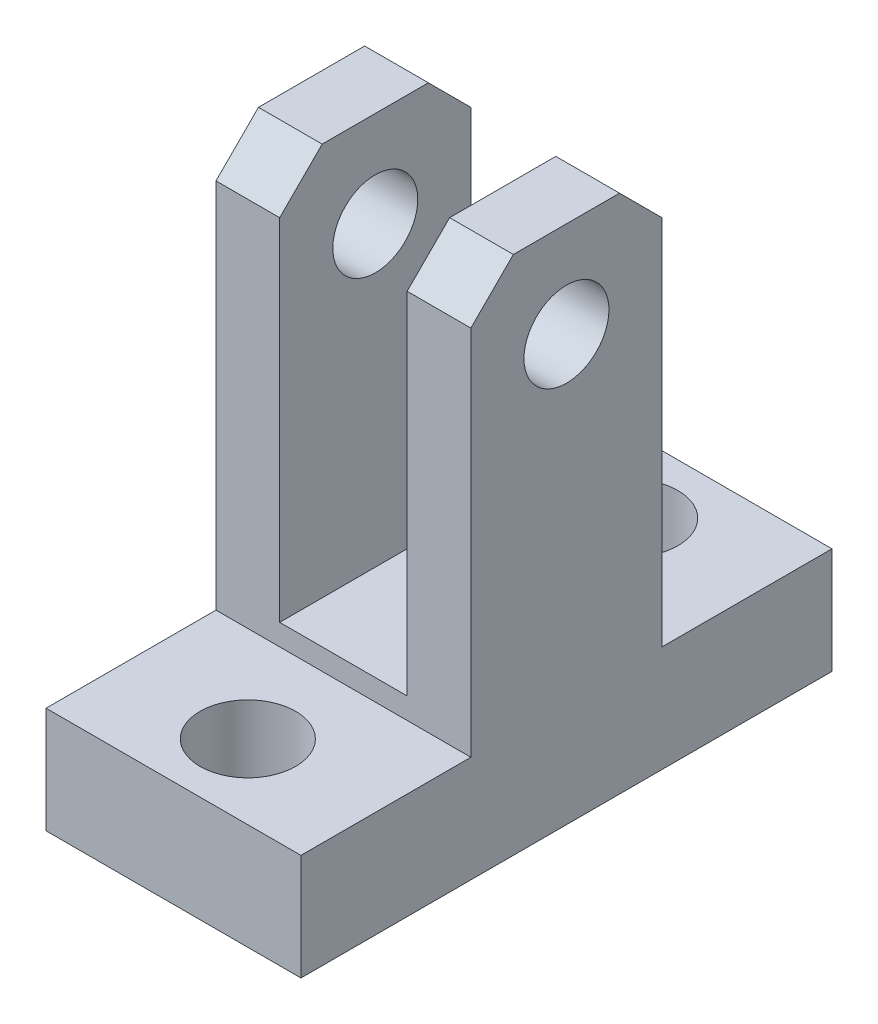
ISO-10303-21;
HEADER;
FILE_DESCRIPTION(('STEP AP214'),'2;1');
FILE_NAME('part.step','',(''),(''),'','','');
FILE_SCHEMA(('AUTOMOTIVE_DESIGN { 1 0 10303 214 1 1 1 1 }'));
ENDSEC;
DATA;
#1=APPLICATION_CONTEXT('core data for automotive mechanical design processes');
#2=APPLICATION_PROTOCOL_DEFINITION('international standard','automotive_design',2000,#1);
#3=PRODUCT_CONTEXT('',#1,'mechanical');
#4=PRODUCT('Part','Part','',(#3));
#5=PRODUCT_RELATED_PRODUCT_CATEGORY('part','',(#4));
#6=PRODUCT_DEFINITION_FORMATION('','',#4);
#7=PRODUCT_DEFINITION_CONTEXT('part definition',#1,'design');
#8=PRODUCT_DEFINITION('design','',#6,#7);
#9=PRODUCT_DEFINITION_SHAPE('','',#8);
#10=(LENGTH_UNIT() NAMED_UNIT(*) SI_UNIT(.MILLI.,.METRE.));
#11=(NAMED_UNIT(*) PLANE_ANGLE_UNIT() SI_UNIT($,.RADIAN.));
#12=(NAMED_UNIT(*) SI_UNIT($,.STERADIAN.) SOLID_ANGLE_UNIT());
#13=UNCERTAINTY_MEASURE_WITH_UNIT(LENGTH_MEASURE(1.E-05),#10,'distance_accuracy_value','');
#14=(GEOMETRIC_REPRESENTATION_CONTEXT(3) GLOBAL_UNCERTAINTY_ASSIGNED_CONTEXT((#13)) GLOBAL_UNIT_ASSIGNED_CONTEXT((#10,
#11,#12)) REPRESENTATION_CONTEXT('',''));
#15=CARTESIAN_POINT('',(0.,0.,0.));
#16=DIRECTION('',(0.,0.,1.));
#17=DIRECTION('',(1.,0.,0.));
#18=AXIS2_PLACEMENT_3D('',#15,#16,#17);
#19=CARTESIAN_POINT('',(6.,24.5,-4.5));
#20=DIRECTION('',(0.,-1.,0.));
#21=DIRECTION('',(0.,0.,-1.));
#22=AXIS2_PLACEMENT_3D('',#19,#20,#21);
#23=PLANE('',#22);
#24=DIRECTION('',(1.,0.,0.));
#25=VECTOR('',#24,1.);
#26=CARTESIAN_POINT('',(6.,24.5,2.49999999999999));
#27=LINE('',#26,#25);
#28=CARTESIAN_POINT('',(-6.,24.5,2.49999999999999));
#29=VERTEX_POINT('',#28);
#30=CARTESIAN_POINT('',(-3.,24.5,2.5));
#31=VERTEX_POINT('',#30);
#32=EDGE_CURVE('E177',#29,#31,#27,.T.);
#33=ORIENTED_EDGE('',*,*,#32,.T.);
#34=DIRECTION('',(0.,0.,1.));
#35=VECTOR('',#34,1.);
#36=CARTESIAN_POINT('',(-3.,24.5,-12.5));
#37=LINE('',#36,#35);
#38=CARTESIAN_POINT('',(-3.,24.5,-2.49999999999999));
#39=VERTEX_POINT('',#38);
#40=EDGE_CURVE('E171',#39,#31,#37,.T.);
#41=ORIENTED_EDGE('',*,*,#40,.F.);
#42=DIRECTION('',(-1.,0.,0.));
#43=VECTOR('',#42,1.);
#44=CARTESIAN_POINT('',(6.,24.5,-2.49999999999999));
#45=LINE('',#44,#43);
#46=CARTESIAN_POINT('',(-6.,24.5,-2.49999999999999));
#47=VERTEX_POINT('',#46);
#48=EDGE_CURVE('E181',#39,#47,#45,.T.);
#49=ORIENTED_EDGE('',*,*,#48,.T.);
#50=DIRECTION('',(0.,0.,1.));
#51=VECTOR('',#50,1.);
#52=CARTESIAN_POINT('',(-6.,24.5,-4.5));
#53=LINE('',#52,#51);
#54=EDGE_CURVE('E243',#47,#29,#53,.T.);
#55=ORIENTED_EDGE('',*,*,#54,.T.);
#56=EDGE_LOOP('',(#33,#41,#49,#55));
#57=FACE_BOUND('',#56,.T.);
#58=ADVANCED_FACE('F39',(#57),#23,.F.);
#59=CARTESIAN_POINT('',(-6.,20.,0.));
#60=DIRECTION('',(1.,0.,0.));
#61=DIRECTION('',(0.,0.,-1.));
#62=AXIS2_PLACEMENT_3D('',#59,#60,#61);
#63=CYLINDRICAL_SURFACE('',#62,2.);
#64=CARTESIAN_POINT('',(-3.,20.,0.));
#65=DIRECTION('',(-1.,0.,0.));
#66=DIRECTION('',(0.,-1.,0.));
#67=AXIS2_PLACEMENT_3D('',#64,#65,#66);
#68=CIRCLE('',#67,2.);
#69=CARTESIAN_POINT('',(-3.,18.,0.));
#70=VERTEX_POINT('',#69);
#71=EDGE_CURVE('E293',#70,#70,#68,.T.);
#72=ORIENTED_EDGE('',*,*,#71,.F.);
#73=EDGE_LOOP('',(#72));
#74=FACE_BOUND('',#73,.T.);
#75=CARTESIAN_POINT('',(-6.,20.,0.));
#76=DIRECTION('',(-1.,0.,0.));
#77=DIRECTION('',(0.,0.,1.));
#78=AXIS2_PLACEMENT_3D('',#75,#76,#77);
#79=CIRCLE('',#78,2.);
#80=CARTESIAN_POINT('',(-6.,20.,2.));
#81=VERTEX_POINT('',#80);
#82=EDGE_CURVE('E257',#81,#81,#79,.T.);
#83=ORIENTED_EDGE('',*,*,#82,.T.);
#84=EDGE_LOOP('',(#83));
#85=FACE_BOUND('',#84,.T.);
#86=ADVANCED_FACE('F363',(#74,#85),#63,.F.);
#87=CARTESIAN_POINT('',(6.,22.5,4.5));
#88=DIRECTION('',(0.,-0.707106781186549,-0.707106781186546));
#89=DIRECTION('',(-1.,0.,0.));
#90=AXIS2_PLACEMENT_3D('',#87,#88,#89);
#91=PLANE('',#90);
#92=DIRECTION('',(0.,0.707106781186546,-0.707106781186549));
#93=VECTOR('',#92,1.);
#94=CARTESIAN_POINT('',(-3.,22.5,4.5));
#95=LINE('',#94,#93);
#96=CARTESIAN_POINT('',(-3.,22.5,4.5));
#97=VERTEX_POINT('',#96);
#98=EDGE_CURVE('E299',#31,#97,#95,.F.);
#99=ORIENTED_EDGE('',*,*,#98,.F.);
#100=ORIENTED_EDGE('',*,*,#32,.F.);
#101=DIRECTION('',(0.,-0.707106781186546,0.707106781186549));
#102=VECTOR('',#101,1.);
#103=CARTESIAN_POINT('',(-6.,22.5,4.5));
#104=LINE('',#103,#102);
#105=CARTESIAN_POINT('',(-6.,22.5,4.5));
#106=VERTEX_POINT('',#105);
#107=EDGE_CURVE('E210',#106,#29,#104,.F.);
#108=ORIENTED_EDGE('',*,*,#107,.F.);
#109=DIRECTION('',(-1.,0.,0.));
#110=VECTOR('',#109,1.);
#111=CARTESIAN_POINT('',(6.,22.5,4.5));
#112=LINE('',#111,#110);
#113=EDGE_CURVE('E218',#97,#106,#112,.T.);
#114=ORIENTED_EDGE('',*,*,#113,.F.);
#115=EDGE_LOOP('',(#99,#100,#108,#114));
#116=FACE_BOUND('',#115,.T.);
#117=ADVANCED_FACE('F327',(#116),#91,.F.);
#118=CARTESIAN_POINT('',(6.,24.5,-2.49999999999999));
#119=DIRECTION('',(0.,-0.707106781186546,0.707106781186549));
#120=DIRECTION('',(-1.,0.,0.));
#121=AXIS2_PLACEMENT_3D('',#118,#119,#120);
#122=PLANE('',#121);
#123=DIRECTION('',(0.,-0.707106781186549,-0.707106781186546));
#124=VECTOR('',#123,1.);
#125=CARTESIAN_POINT('',(-3.,24.5,-2.49999999999999));
#126=LINE('',#125,#124);
#127=CARTESIAN_POINT('',(-3.,22.5,-4.5));
#128=VERTEX_POINT('',#127);
#129=EDGE_CURVE('E47',#128,#39,#126,.F.);
#130=ORIENTED_EDGE('',*,*,#129,.F.);
#131=DIRECTION('',(1.,0.,0.));
#132=VECTOR('',#131,1.);
#133=CARTESIAN_POINT('',(6.,22.5,-4.5));
#134=LINE('',#133,#132);
#135=CARTESIAN_POINT('',(-6.,22.5,-4.5));
#136=VERTEX_POINT('',#135);
#137=EDGE_CURVE('E187',#136,#128,#134,.T.);
#138=ORIENTED_EDGE('',*,*,#137,.F.);
#139=DIRECTION('',(0.,0.707106781186549,0.707106781186546));
#140=VECTOR('',#139,1.);
#141=CARTESIAN_POINT('',(-6.,24.5,-2.49999999999999));
#142=LINE('',#141,#140);
#143=EDGE_CURVE('E208',#47,#136,#142,.F.);
#144=ORIENTED_EDGE('',*,*,#143,.F.);
#145=ORIENTED_EDGE('',*,*,#48,.F.);
#146=EDGE_LOOP('',(#130,#138,#144,#145));
#147=FACE_BOUND('',#146,.T.);
#148=ADVANCED_FACE('F207',(#147),#122,.F.);
#149=CARTESIAN_POINT('',(6.,0.,0.));
#150=DIRECTION('',(1.,0.,0.));
#151=DIRECTION('',(0.,0.,-1.));
#152=AXIS2_PLACEMENT_3D('',#149,#150,#151);
#153=PLANE('',#152);
#154=DIRECTION('',(0.,0.,1.));
#155=VECTOR('',#154,1.);
#156=CARTESIAN_POINT('',(6.,24.5,-4.5));
#157=LINE('',#156,#155);
#158=CARTESIAN_POINT('',(6.,24.5,-2.49999999999999));
#159=VERTEX_POINT('',#158);
#160=CARTESIAN_POINT('',(6.,24.5,2.49999999999999));
#161=VERTEX_POINT('',#160);
#162=EDGE_CURVE('E261',#159,#161,#157,.T.);
#163=ORIENTED_EDGE('',*,*,#162,.T.);
#164=DIRECTION('',(0.,0.707106781186546,-0.707106781186549));
#165=VECTOR('',#164,1.);
#166=CARTESIAN_POINT('',(6.,13.5,13.5));
#167=LINE('',#166,#165);
#168=CARTESIAN_POINT('',(6.,22.5,4.5));
#169=VERTEX_POINT('',#168);
#170=EDGE_CURVE('E176',#161,#169,#167,.F.);
#171=ORIENTED_EDGE('',*,*,#170,.T.);
#172=DIRECTION('',(0.,-1.,0.));
#173=VECTOR('',#172,1.);
#174=CARTESIAN_POINT('',(6.,24.5,4.5));
#175=LINE('',#174,#173);
#176=CARTESIAN_POINT('',(6.,5.,4.5));
#177=VERTEX_POINT('',#176);
#178=EDGE_CURVE('E259',#169,#177,#175,.T.);
#179=ORIENTED_EDGE('',*,*,#178,.T.);
#180=DIRECTION('',(0.,0.,1.));
#181=VECTOR('',#180,1.);
#182=CARTESIAN_POINT('',(6.,5.,4.5));
#183=LINE('',#182,#181);
#184=CARTESIAN_POINT('',(6.,5.,12.5));
#185=VERTEX_POINT('',#184);
#186=EDGE_CURVE('E237',#177,#185,#183,.T.);
#187=ORIENTED_EDGE('',*,*,#186,.T.);
#188=DIRECTION('',(0.,-1.,0.));
#189=VECTOR('',#188,1.);
#190=CARTESIAN_POINT('',(6.,5.,12.5));
#191=LINE('',#190,#189);
#192=CARTESIAN_POINT('',(6.,0.,12.5));
#193=VERTEX_POINT('',#192);
#194=EDGE_CURVE('E240',#185,#193,#191,.T.);
#195=ORIENTED_EDGE('',*,*,#194,.T.);
#196=DIRECTION('',(0.,0.,-1.));
#197=VECTOR('',#196,1.);
#198=CARTESIAN_POINT('',(6.,0.,12.5));
#199=LINE('',#198,#197);
#200=CARTESIAN_POINT('',(6.,0.,-12.5));
#201=VERTEX_POINT('',#200);
#202=EDGE_CURVE('E269',#193,#201,#199,.T.);
#203=ORIENTED_EDGE('',*,*,#202,.T.);
#204=DIRECTION('',(0.,1.,0.));
#205=VECTOR('',#204,1.);
#206=CARTESIAN_POINT('',(6.,0.,-12.5));
#207=LINE('',#206,#205);
#208=CARTESIAN_POINT('',(6.,5.,-12.5));
#209=VERTEX_POINT('',#208);
#210=EDGE_CURVE('E267',#201,#209,#207,.T.);
#211=ORIENTED_EDGE('',*,*,#210,.T.);
#212=DIRECTION('',(0.,0.,1.));
#213=VECTOR('',#212,1.);
#214=CARTESIAN_POINT('',(6.,5.,-12.5));
#215=LINE('',#214,#213);
#216=CARTESIAN_POINT('',(6.,5.,-4.5));
#217=VERTEX_POINT('',#216);
#218=EDGE_CURVE('E265',#209,#217,#215,.T.);
#219=ORIENTED_EDGE('',*,*,#218,.T.);
#220=DIRECTION('',(0.,1.,0.));
#221=VECTOR('',#220,1.);
#222=CARTESIAN_POINT('',(6.,5.,-4.5));
#223=LINE('',#222,#221);
#224=CARTESIAN_POINT('',(6.,22.5,-4.5));
#225=VERTEX_POINT('',#224);
#226=EDGE_CURVE('E263',#217,#225,#223,.T.);
#227=ORIENTED_EDGE('',*,*,#226,.T.);
#228=DIRECTION('',(0.,-0.707106781186549,-0.707106781186546));
#229=VECTOR('',#228,1.);
#230=CARTESIAN_POINT('',(6.,13.5,-13.5));
#231=LINE('',#230,#229);
#232=EDGE_CURVE('E180',#225,#159,#231,.F.);
#233=ORIENTED_EDGE('',*,*,#232,.T.);
#234=EDGE_LOOP('',(#163,#171,#179,#187,#195,#203,#211,#219,#227,#233));
#235=FACE_BOUND('',#234,.T.);
#236=CARTESIAN_POINT('',(6.,20.,0.));
#237=DIRECTION('',(-1.,0.,0.));
#238=DIRECTION('',(0.,0.,1.));
#239=AXIS2_PLACEMENT_3D('',#236,#237,#238);
#240=CIRCLE('',#239,2.);
#241=CARTESIAN_POINT('',(6.,20.,2.));
#242=VERTEX_POINT('',#241);
#243=EDGE_CURVE('E273',#242,#242,#240,.T.);
#244=ORIENTED_EDGE('',*,*,#243,.T.);
#245=EDGE_LOOP('',(#244));
#246=FACE_BOUND('',#245,.T.);
#247=ADVANCED_FACE('F318',(#235,#246),#153,.T.);
#248=CARTESIAN_POINT('',(-6.,0.,0.));
#249=DIRECTION('',(1.,0.,0.));
#250=DIRECTION('',(0.,0.,-1.));
#251=AXIS2_PLACEMENT_3D('',#248,#249,#250);
#252=PLANE('',#251);
#253=DIRECTION('',(0.,-1.,0.));
#254=VECTOR('',#253,1.);
#255=CARTESIAN_POINT('',(-6.,24.5,4.5));
#256=LINE('',#255,#254);
#257=CARTESIAN_POINT('',(-6.,5.,4.5));
#258=VERTEX_POINT('',#257);
#259=EDGE_CURVE('E241',#106,#258,#256,.T.);
#260=ORIENTED_EDGE('',*,*,#259,.F.);
#261=ORIENTED_EDGE('',*,*,#107,.T.);
#262=ORIENTED_EDGE('',*,*,#54,.F.);
#263=ORIENTED_EDGE('',*,*,#143,.T.);
#264=DIRECTION('',(0.,1.,0.));
#265=VECTOR('',#264,1.);
#266=CARTESIAN_POINT('',(-6.,5.,-4.5));
#267=LINE('',#266,#265);
#268=CARTESIAN_POINT('',(-6.,5.,-4.5));
#269=VERTEX_POINT('',#268);
#270=EDGE_CURVE('E245',#269,#136,#267,.T.);
#271=ORIENTED_EDGE('',*,*,#270,.F.);
#272=DIRECTION('',(0.,0.,1.));
#273=VECTOR('',#272,1.);
#274=CARTESIAN_POINT('',(-6.,5.,-12.5));
#275=LINE('',#274,#273);
#276=CARTESIAN_POINT('',(-6.,5.,-12.5));
#277=VERTEX_POINT('',#276);
#278=EDGE_CURVE('E248',#277,#269,#275,.T.);
#279=ORIENTED_EDGE('',*,*,#278,.F.);
#280=DIRECTION('',(0.,1.,0.));
#281=VECTOR('',#280,1.);
#282=CARTESIAN_POINT('',(-6.,0.,-12.5));
#283=LINE('',#282,#281);
#284=CARTESIAN_POINT('',(-6.,0.,-12.5));
#285=VERTEX_POINT('',#284);
#286=EDGE_CURVE('E250',#285,#277,#283,.T.);
#287=ORIENTED_EDGE('',*,*,#286,.F.);
#288=DIRECTION('',(0.,0.,-1.));
#289=VECTOR('',#288,1.);
#290=CARTESIAN_POINT('',(-6.,0.,12.5));
#291=LINE('',#290,#289);
#292=CARTESIAN_POINT('',(-6.,0.,12.5));
#293=VERTEX_POINT('',#292);
#294=EDGE_CURVE('E252',#293,#285,#291,.T.);
#295=ORIENTED_EDGE('',*,*,#294,.F.);
#296=DIRECTION('',(0.,-1.,0.));
#297=VECTOR('',#296,1.);
#298=CARTESIAN_POINT('',(-6.,5.,12.5));
#299=LINE('',#298,#297);
#300=CARTESIAN_POINT('',(-6.,5.,12.5));
#301=VERTEX_POINT('',#300);
#302=EDGE_CURVE('E254',#301,#293,#299,.T.);
#303=ORIENTED_EDGE('',*,*,#302,.F.);
#304=DIRECTION('',(0.,0.,1.));
#305=VECTOR('',#304,1.);
#306=CARTESIAN_POINT('',(-6.,5.,4.5));
#307=LINE('',#306,#305);
#308=EDGE_CURVE('E238',#258,#301,#307,.T.);
#309=ORIENTED_EDGE('',*,*,#308,.F.);
#310=EDGE_LOOP('',(#260,#261,#262,#263,#271,#279,#287,#295,#303,#309));
#311=FACE_BOUND('',#310,.T.);
#312=ORIENTED_EDGE('',*,*,#82,.F.);
#313=EDGE_LOOP('',(#312));
#314=FACE_BOUND('',#313,.T.);
#315=ADVANCED_FACE('F329',(#311,#314),#252,.F.);
#316=CARTESIAN_POINT('',(6.,5.,12.5));
#317=DIRECTION('',(0.,0.,-1.));
#318=DIRECTION('',(-1.,0.,0.));
#319=AXIS2_PLACEMENT_3D('',#316,#317,#318);
#320=PLANE('',#319);
#321=ORIENTED_EDGE('',*,*,#302,.T.);
#322=DIRECTION('',(-1.,0.,0.));
#323=VECTOR('',#322,1.);
#324=CARTESIAN_POINT('',(6.,0.,12.5));
#325=LINE('',#324,#323);
#326=EDGE_CURVE('E219',#193,#293,#325,.T.);
#327=ORIENTED_EDGE('',*,*,#326,.F.);
#328=ORIENTED_EDGE('',*,*,#194,.F.);
#329=DIRECTION('',(-1.,0.,0.));
#330=VECTOR('',#329,1.);
#331=CARTESIAN_POINT('',(6.,5.,12.5));
#332=LINE('',#331,#330);
#333=EDGE_CURVE('E234',#185,#301,#332,.T.);
#334=ORIENTED_EDGE('',*,*,#333,.T.);
#335=EDGE_LOOP('',(#321,#327,#328,#334));
#336=FACE_BOUND('',#335,.T.);
#337=ADVANCED_FACE('F337',(#336),#320,.F.);
#338=CARTESIAN_POINT('',(6.,0.,12.5));
#339=DIRECTION('',(0.,1.,0.));
#340=DIRECTION('',(0.,0.,1.));
#341=AXIS2_PLACEMENT_3D('',#338,#339,#340);
#342=PLANE('',#341);
#343=CARTESIAN_POINT('',(0.,0.,9.));
#344=DIRECTION('',(0.,1.,0.));
#345=DIRECTION('',(0.,0.,1.));
#346=AXIS2_PLACEMENT_3D('',#343,#344,#345);
#347=CIRCLE('',#346,2.25);
#348=CARTESIAN_POINT('',(0.,0.,11.25));
#349=VERTEX_POINT('',#348);
#350=EDGE_CURVE('E284',#349,#349,#347,.T.);
#351=ORIENTED_EDGE('',*,*,#350,.T.);
#352=EDGE_LOOP('',(#351));
#353=FACE_BOUND('',#352,.T.);
#354=CARTESIAN_POINT('',(0.,0.,-9.));
#355=DIRECTION('',(0.,1.,0.));
#356=DIRECTION('',(0.,0.,1.));
#357=AXIS2_PLACEMENT_3D('',#354,#355,#356);
#358=CIRCLE('',#357,2.25);
#359=CARTESIAN_POINT('',(0.,0.,-6.75));
#360=VERTEX_POINT('',#359);
#361=EDGE_CURVE('E276',#360,#360,#358,.T.);
#362=ORIENTED_EDGE('',*,*,#361,.T.);
#363=EDGE_LOOP('',(#362));
#364=FACE_BOUND('',#363,.T.);
#365=ORIENTED_EDGE('',*,*,#294,.T.);
#366=DIRECTION('',(-1.,0.,0.));
#367=VECTOR('',#366,1.);
#368=CARTESIAN_POINT('',(6.,0.,-12.5));
#369=LINE('',#368,#367);
#370=EDGE_CURVE('E222',#201,#285,#369,.T.);
#371=ORIENTED_EDGE('',*,*,#370,.F.);
#372=ORIENTED_EDGE('',*,*,#202,.F.);
#373=ORIENTED_EDGE('',*,*,#326,.T.);
#374=EDGE_LOOP('',(#365,#371,#372,#373));
#375=FACE_BOUND('',#374,.T.);
#376=ADVANCED_FACE('F342',(#353,#364,#375),#342,.F.);
#377=CARTESIAN_POINT('',(6.,0.,-12.5));
#378=DIRECTION('',(0.,0.,1.));
#379=DIRECTION('',(1.,0.,0.));
#380=AXIS2_PLACEMENT_3D('',#377,#378,#379);
#381=PLANE('',#380);
#382=ORIENTED_EDGE('',*,*,#286,.T.);
#383=DIRECTION('',(-1.,0.,0.));
#384=VECTOR('',#383,1.);
#385=CARTESIAN_POINT('',(6.,5.,-12.5));
#386=LINE('',#385,#384);
#387=EDGE_CURVE('E225',#209,#277,#386,.T.);
#388=ORIENTED_EDGE('',*,*,#387,.F.);
#389=ORIENTED_EDGE('',*,*,#210,.F.);
#390=ORIENTED_EDGE('',*,*,#370,.T.);
#391=EDGE_LOOP('',(#382,#388,#389,#390));
#392=FACE_BOUND('',#391,.T.);
#393=ADVANCED_FACE('F345',(#392),#381,.F.);
#394=CARTESIAN_POINT('',(6.,5.,-12.5));
#395=DIRECTION('',(0.,-1.,0.));
#396=DIRECTION('',(0.,0.,-1.));
#397=AXIS2_PLACEMENT_3D('',#394,#395,#396);
#398=PLANE('',#397);
#399=CARTESIAN_POINT('',(0.,5.,-9.));
#400=DIRECTION('',(0.,1.,0.));
#401=DIRECTION('',(0.,0.,1.));
#402=AXIS2_PLACEMENT_3D('',#399,#400,#401);
#403=CIRCLE('',#402,2.24999999999999);
#404=CARTESIAN_POINT('',(0.,5.,-6.75000000000001));
#405=VERTEX_POINT('',#404);
#406=EDGE_CURVE('E281',#405,#405,#403,.T.);
#407=ORIENTED_EDGE('',*,*,#406,.F.);
#408=EDGE_LOOP('',(#407));
#409=FACE_BOUND('',#408,.T.);
#410=ORIENTED_EDGE('',*,*,#278,.T.);
#411=DIRECTION('',(-1.,0.,0.));
#412=VECTOR('',#411,1.);
#413=CARTESIAN_POINT('',(6.,5.,-4.5));
#414=LINE('',#413,#412);
#415=EDGE_CURVE('E228',#217,#269,#414,.T.);
#416=ORIENTED_EDGE('',*,*,#415,.F.);
#417=ORIENTED_EDGE('',*,*,#218,.F.);
#418=ORIENTED_EDGE('',*,*,#387,.T.);
#419=EDGE_LOOP('',(#410,#416,#417,#418));
#420=FACE_BOUND('',#419,.T.);
#421=ADVANCED_FACE('F350',(#409,#420),#398,.F.);
#422=CARTESIAN_POINT('',(6.,5.,-4.5));
#423=DIRECTION('',(0.,0.,1.));
#424=DIRECTION('',(0.,-1.,0.));
#425=AXIS2_PLACEMENT_3D('',#422,#423,#424);
#426=PLANE('',#425);
#427=ORIENTED_EDGE('',*,*,#137,.T.);
#428=DIRECTION('',(0.,-1.,0.));
#429=VECTOR('',#428,1.);
#430=CARTESIAN_POINT('',(-3.,5.,-4.5));
#431=LINE('',#430,#429);
#432=CARTESIAN_POINT('',(-3.,6.,-4.5));
#433=VERTEX_POINT('',#432);
#434=EDGE_CURVE('E198',#128,#433,#431,.T.);
#435=ORIENTED_EDGE('',*,*,#434,.T.);
#436=DIRECTION('',(1.,0.,0.));
#437=VECTOR('',#436,1.);
#438=CARTESIAN_POINT('',(6.,6.,-4.5));
#439=LINE('',#438,#437);
#440=CARTESIAN_POINT('',(3.,6.,-4.5));
#441=VERTEX_POINT('',#440);
#442=EDGE_CURVE('E290',#433,#441,#439,.T.);
#443=ORIENTED_EDGE('',*,*,#442,.T.);
#444=DIRECTION('',(0.,1.,0.));
#445=VECTOR('',#444,1.);
#446=CARTESIAN_POINT('',(3.,5.,-4.5));
#447=LINE('',#446,#445);
#448=CARTESIAN_POINT('',(3.,22.5,-4.5));
#449=VERTEX_POINT('',#448);
#450=EDGE_CURVE('E161',#441,#449,#447,.T.);
#451=ORIENTED_EDGE('',*,*,#450,.T.);
#452=EDGE_CURVE('E62',#449,#225,#134,.T.);
#453=ORIENTED_EDGE('',*,*,#452,.T.);
#454=ORIENTED_EDGE('',*,*,#226,.F.);
#455=ORIENTED_EDGE('',*,*,#415,.T.);
#456=ORIENTED_EDGE('',*,*,#270,.T.);
#457=EDGE_LOOP('',(#427,#435,#443,#451,#453,#454,#455,#456));
#458=FACE_BOUND('',#457,.T.);
#459=ADVANCED_FACE('F323',(#458),#426,.F.);
#460=CARTESIAN_POINT('',(3.,24.5,-2.49999999999999));
#461=VERTEX_POINT('',#460);
#462=EDGE_CURVE('E170',#159,#461,#45,.T.);
#463=ORIENTED_EDGE('',*,*,#462,.T.);
#464=DIRECTION('',(0.,0.,1.));
#465=VECTOR('',#464,1.);
#466=CARTESIAN_POINT('',(3.,24.5,-12.5));
#467=LINE('',#466,#465);
#468=CARTESIAN_POINT('',(3.,24.5,2.49999999999999));
#469=VERTEX_POINT('',#468);
#470=EDGE_CURVE('E54',#461,#469,#467,.T.);
#471=ORIENTED_EDGE('',*,*,#470,.T.);
#472=EDGE_CURVE('E167',#469,#161,#27,.T.);
#473=ORIENTED_EDGE('',*,*,#472,.T.);
#474=ORIENTED_EDGE('',*,*,#162,.F.);
#475=EDGE_LOOP('',(#463,#471,#473,#474));
#476=FACE_BOUND('',#475,.T.);
#477=ADVANCED_FACE('F165',(#476),#23,.F.);
#478=CARTESIAN_POINT('',(6.,24.5,4.5));
#479=DIRECTION('',(0.,0.,-1.));
#480=DIRECTION('',(0.,1.,0.));
#481=AXIS2_PLACEMENT_3D('',#478,#479,#480);
#482=PLANE('',#481);
#483=DIRECTION('',(-1.,0.,0.));
#484=VECTOR('',#483,1.);
#485=CARTESIAN_POINT('',(6.,6.,4.5));
#486=LINE('',#485,#484);
#487=CARTESIAN_POINT('',(3.,6.,4.5));
#488=VERTEX_POINT('',#487);
#489=CARTESIAN_POINT('',(-3.,6.,4.5));
#490=VERTEX_POINT('',#489);
#491=EDGE_CURVE('E11',#488,#490,#486,.T.);
#492=ORIENTED_EDGE('',*,*,#491,.T.);
#493=DIRECTION('',(0.,1.,0.));
#494=VECTOR('',#493,1.);
#495=CARTESIAN_POINT('',(-3.,24.5,4.5));
#496=LINE('',#495,#494);
#497=EDGE_CURVE('E296',#490,#97,#496,.T.);
#498=ORIENTED_EDGE('',*,*,#497,.T.);
#499=ORIENTED_EDGE('',*,*,#113,.T.);
#500=ORIENTED_EDGE('',*,*,#259,.T.);
#501=DIRECTION('',(-1.,0.,0.));
#502=VECTOR('',#501,1.);
#503=CARTESIAN_POINT('',(6.,5.,4.5));
#504=LINE('',#503,#502);
#505=EDGE_CURVE('E231',#177,#258,#504,.T.);
#506=ORIENTED_EDGE('',*,*,#505,.F.);
#507=ORIENTED_EDGE('',*,*,#178,.F.);
#508=CARTESIAN_POINT('',(3.,22.5,4.5));
#509=VERTEX_POINT('',#508);
#510=EDGE_CURVE('E214',#169,#509,#112,.T.);
#511=ORIENTED_EDGE('',*,*,#510,.T.);
#512=DIRECTION('',(0.,-1.,0.));
#513=VECTOR('',#512,1.);
#514=CARTESIAN_POINT('',(3.,24.5,4.5));
#515=LINE('',#514,#513);
#516=EDGE_CURVE('E156',#509,#488,#515,.T.);
#517=ORIENTED_EDGE('',*,*,#516,.T.);
#518=EDGE_LOOP('',(#492,#498,#499,#500,#506,#507,#511,#517));
#519=FACE_BOUND('',#518,.T.);
#520=ADVANCED_FACE('F313',(#519),#482,.F.);
#521=CARTESIAN_POINT('',(6.,5.,4.5));
#522=DIRECTION('',(0.,-1.,0.));
#523=DIRECTION('',(0.,0.,-1.));
#524=AXIS2_PLACEMENT_3D('',#521,#522,#523);
#525=PLANE('',#524);
#526=CARTESIAN_POINT('',(0.,5.,9.));
#527=DIRECTION('',(0.,1.,0.));
#528=DIRECTION('',(0.,0.,1.));
#529=AXIS2_PLACEMENT_3D('',#526,#527,#528);
#530=CIRCLE('',#529,2.24999999999999);
#531=CARTESIAN_POINT('',(0.,5.,11.25));
#532=VERTEX_POINT('',#531);
#533=EDGE_CURVE('E287',#532,#532,#530,.T.);
#534=ORIENTED_EDGE('',*,*,#533,.F.);
#535=EDGE_LOOP('',(#534));
#536=FACE_BOUND('',#535,.T.);
#537=ORIENTED_EDGE('',*,*,#308,.T.);
#538=ORIENTED_EDGE('',*,*,#333,.F.);
#539=ORIENTED_EDGE('',*,*,#186,.F.);
#540=ORIENTED_EDGE('',*,*,#505,.T.);
#541=EDGE_LOOP('',(#537,#538,#539,#540));
#542=FACE_BOUND('',#541,.T.);
#543=ADVANCED_FACE('F333',(#536,#542),#525,.F.);
#544=CARTESIAN_POINT('',(3.,20.,0.));
#545=DIRECTION('',(1.,0.,0.));
#546=DIRECTION('',(0.,1.,0.));
#547=AXIS2_PLACEMENT_3D('',#544,#545,#546);
#548=CIRCLE('',#547,2.);
#549=CARTESIAN_POINT('',(3.,22.,0.));
#550=VERTEX_POINT('',#549);
#551=EDGE_CURVE('E302',#550,#550,#548,.T.);
#552=ORIENTED_EDGE('',*,*,#551,.F.);
#553=EDGE_LOOP('',(#552));
#554=FACE_BOUND('',#553,.T.);
#555=ORIENTED_EDGE('',*,*,#243,.F.);
#556=EDGE_LOOP('',(#555));
#557=FACE_BOUND('',#556,.T.);
#558=ADVANCED_FACE('F370',(#554,#557),#63,.F.);
#559=DIRECTION('',(0.,-0.707106781186546,0.707106781186549));
#560=VECTOR('',#559,1.);
#561=CARTESIAN_POINT('',(3.,22.5,4.5));
#562=LINE('',#561,#560);
#563=EDGE_CURVE('E152',#509,#469,#562,.F.);
#564=ORIENTED_EDGE('',*,*,#563,.F.);
#565=ORIENTED_EDGE('',*,*,#510,.F.);
#566=ORIENTED_EDGE('',*,*,#170,.F.);
#567=ORIENTED_EDGE('',*,*,#472,.F.);
#568=EDGE_LOOP('',(#564,#565,#566,#567));
#569=FACE_BOUND('',#568,.T.);
#570=ADVANCED_FACE('F175',(#569),#91,.F.);
#571=DIRECTION('',(0.,0.707106781186549,0.707106781186546));
#572=VECTOR('',#571,1.);
#573=CARTESIAN_POINT('',(3.,24.5,-2.49999999999999));
#574=LINE('',#573,#572);
#575=EDGE_CURVE('E190',#461,#449,#574,.F.);
#576=ORIENTED_EDGE('',*,*,#575,.F.);
#577=ORIENTED_EDGE('',*,*,#462,.F.);
#578=ORIENTED_EDGE('',*,*,#232,.F.);
#579=ORIENTED_EDGE('',*,*,#452,.F.);
#580=EDGE_LOOP('',(#576,#577,#578,#579));
#581=FACE_BOUND('',#580,.T.);
#582=ADVANCED_FACE('F41',(#581),#122,.F.);
#583=CARTESIAN_POINT('',(0.,5.,-9.));
#584=DIRECTION('',(0.,1.,0.));
#585=DIRECTION('',(0.,0.,1.));
#586=AXIS2_PLACEMENT_3D('',#583,#584,#585);
#587=CYLINDRICAL_SURFACE('',#586,2.24999999999999);
#588=ORIENTED_EDGE('',*,*,#361,.F.);
#589=EDGE_LOOP('',(#588));
#590=FACE_BOUND('',#589,.T.);
#591=ORIENTED_EDGE('',*,*,#406,.T.);
#592=EDGE_LOOP('',(#591));
#593=FACE_BOUND('',#592,.T.);
#594=ADVANCED_FACE('F388',(#590,#593),#587,.F.);
#595=CARTESIAN_POINT('',(0.,5.,9.));
#596=DIRECTION('',(0.,1.,0.));
#597=DIRECTION('',(0.,0.,1.));
#598=AXIS2_PLACEMENT_3D('',#595,#596,#597);
#599=CYLINDRICAL_SURFACE('',#598,2.24999999999999);
#600=ORIENTED_EDGE('',*,*,#350,.F.);
#601=EDGE_LOOP('',(#600));
#602=FACE_BOUND('',#601,.T.);
#603=ORIENTED_EDGE('',*,*,#533,.T.);
#604=EDGE_LOOP('',(#603));
#605=FACE_BOUND('',#604,.T.);
#606=ADVANCED_FACE('F391',(#602,#605),#599,.F.);
#607=CARTESIAN_POINT('',(-3.,6.,-12.5));
#608=DIRECTION('',(0.,-1.,0.));
#609=DIRECTION('',(0.,0.,-1.));
#610=AXIS2_PLACEMENT_3D('',#607,#608,#609);
#611=PLANE('',#610);
#612=DIRECTION('',(0.,0.,1.));
#613=VECTOR('',#612,1.);
#614=CARTESIAN_POINT('',(-3.,6.,-12.5));
#615=LINE('',#614,#613);
#616=EDGE_CURVE('E307',#433,#490,#615,.T.);
#617=ORIENTED_EDGE('',*,*,#616,.T.);
#618=ORIENTED_EDGE('',*,*,#491,.F.);
#619=DIRECTION('',(0.,0.,1.));
#620=VECTOR('',#619,1.);
#621=CARTESIAN_POINT('',(3.,6.,-12.5));
#622=LINE('',#621,#620);
#623=EDGE_CURVE('E172',#441,#488,#622,.T.);
#624=ORIENTED_EDGE('',*,*,#623,.F.);
#625=ORIENTED_EDGE('',*,*,#442,.F.);
#626=EDGE_LOOP('',(#617,#618,#624,#625));
#627=FACE_BOUND('',#626,.T.);
#628=ADVANCED_FACE('F324',(#627),#611,.F.);
#629=CARTESIAN_POINT('',(-3.,24.5,-12.5));
#630=DIRECTION('',(-1.,0.,0.));
#631=DIRECTION('',(0.,-1.,0.));
#632=AXIS2_PLACEMENT_3D('',#629,#630,#631);
#633=PLANE('',#632);
#634=ORIENTED_EDGE('',*,*,#71,.T.);
#635=EDGE_LOOP('',(#634));
#636=FACE_BOUND('',#635,.T.);
#637=ORIENTED_EDGE('',*,*,#616,.F.);
#638=ORIENTED_EDGE('',*,*,#434,.F.);
#639=ORIENTED_EDGE('',*,*,#129,.T.);
#640=ORIENTED_EDGE('',*,*,#40,.T.);
#641=ORIENTED_EDGE('',*,*,#98,.T.);
#642=ORIENTED_EDGE('',*,*,#497,.F.);
#643=EDGE_LOOP('',(#637,#638,#639,#640,#641,#642));
#644=FACE_BOUND('',#643,.T.);
#645=ADVANCED_FACE('F195',(#636,#644),#633,.F.);
#646=CARTESIAN_POINT('',(3.,24.5,-12.5));
#647=DIRECTION('',(1.,0.,0.));
#648=DIRECTION('',(0.,1.,0.));
#649=AXIS2_PLACEMENT_3D('',#646,#647,#648);
#650=PLANE('',#649);
#651=ORIENTED_EDGE('',*,*,#551,.T.);
#652=EDGE_LOOP('',(#651));
#653=FACE_BOUND('',#652,.T.);
#654=ORIENTED_EDGE('',*,*,#563,.T.);
#655=ORIENTED_EDGE('',*,*,#470,.F.);
#656=ORIENTED_EDGE('',*,*,#575,.T.);
#657=ORIENTED_EDGE('',*,*,#450,.F.);
#658=ORIENTED_EDGE('',*,*,#623,.T.);
#659=ORIENTED_EDGE('',*,*,#516,.F.);
#660=EDGE_LOOP('',(#654,#655,#656,#657,#658,#659));
#661=FACE_BOUND('',#660,.T.);
#662=ADVANCED_FACE('F153',(#653,#661),#650,.F.);
#663=CLOSED_SHELL('',(#58,#86,#117,#148,#247,#315,#337,#376,#393,#421,#459,#477,#520,#543,#558,
#570,#582,#594,#606,#628,#645,#662));
#664=MANIFOLD_SOLID_BREP('B2',#663);
#665=ADVANCED_BREP_SHAPE_REPRESENTATION('',(#18,#664),#14);
#666=SHAPE_DEFINITION_REPRESENTATION(#9,#665);
ENDSEC;
END-ISO-10303-21;
